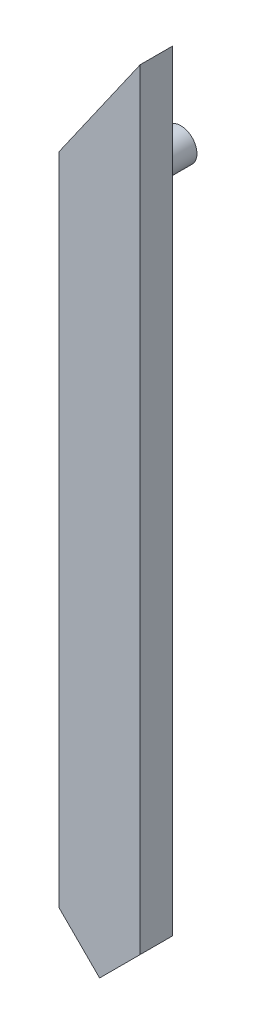
ISO-10303-21;
HEADER;
FILE_DESCRIPTION(('STEP AP214'),'2;1');
FILE_NAME('part.step','',(''),(''),'','','');
FILE_SCHEMA(('AUTOMOTIVE_DESIGN { 1 0 10303 214 1 1 1 1 }'));
ENDSEC;
DATA;
#1=APPLICATION_CONTEXT('core data for automotive mechanical design processes');
#2=APPLICATION_PROTOCOL_DEFINITION('international standard','automotive_design',2000,#1);
#3=PRODUCT_CONTEXT('',#1,'mechanical');
#4=PRODUCT('Part','Part','',(#3));
#5=PRODUCT_RELATED_PRODUCT_CATEGORY('part','',(#4));
#6=PRODUCT_DEFINITION_FORMATION('','',#4);
#7=PRODUCT_DEFINITION_CONTEXT('part definition',#1,'design');
#8=PRODUCT_DEFINITION('design','',#6,#7);
#9=PRODUCT_DEFINITION_SHAPE('','',#8);
#10=(LENGTH_UNIT() NAMED_UNIT(*) SI_UNIT(.MILLI.,.METRE.));
#11=(NAMED_UNIT(*) PLANE_ANGLE_UNIT() SI_UNIT($,.RADIAN.));
#12=(NAMED_UNIT(*) SI_UNIT($,.STERADIAN.) SOLID_ANGLE_UNIT());
#13=UNCERTAINTY_MEASURE_WITH_UNIT(LENGTH_MEASURE(1.E-05),#10,'distance_accuracy_value','');
#14=(GEOMETRIC_REPRESENTATION_CONTEXT(3) GLOBAL_UNCERTAINTY_ASSIGNED_CONTEXT((#13)) GLOBAL_UNIT_ASSIGNED_CONTEXT((#10,
#11,#12)) REPRESENTATION_CONTEXT('',''));
#15=CARTESIAN_POINT('',(0.,0.,0.));
#16=DIRECTION('',(0.,0.,1.));
#17=DIRECTION('',(1.,0.,0.));
#18=AXIS2_PLACEMENT_3D('',#15,#16,#17);
#19=CARTESIAN_POINT('',(4.99999999999999,50.,4.));
#20=DIRECTION('',(-1.,0.,0.));
#21=DIRECTION('',(0.,-1.,0.));
#22=AXIS2_PLACEMENT_3D('',#19,#20,#21);
#23=PLANE('',#22);
#24=DIRECTION('',(0.,1.,0.));
#25=VECTOR('',#24,1.);
#26=CARTESIAN_POINT('',(4.99999999999999,50.,4.));
#27=LINE('',#26,#25);
#28=CARTESIAN_POINT('',(5.00000000000001,-45.,4.));
#29=VERTEX_POINT('',#28);
#30=CARTESIAN_POINT('',(4.99999999999999,50.,4.));
#31=VERTEX_POINT('',#30);
#32=EDGE_CURVE('E117',#29,#31,#27,.T.);
#33=ORIENTED_EDGE('',*,*,#32,.F.);
#34=DIRECTION('',(0.,0.,-1.));
#35=VECTOR('',#34,1.);
#36=CARTESIAN_POINT('',(5.00000000000001,-45.,4.));
#37=LINE('',#36,#35);
#38=CARTESIAN_POINT('',(5.00000000000001,-45.,0.));
#39=VERTEX_POINT('',#38);
#40=EDGE_CURVE('E11',#29,#39,#37,.T.);
#41=ORIENTED_EDGE('',*,*,#40,.T.);
#42=DIRECTION('',(0.,1.,0.));
#43=VECTOR('',#42,1.);
#44=CARTESIAN_POINT('',(4.99999999999999,50.,0.));
#45=LINE('',#44,#43);
#46=CARTESIAN_POINT('',(4.99999999999999,50.,0.));
#47=VERTEX_POINT('',#46);
#48=EDGE_CURVE('E111',#39,#47,#45,.T.);
#49=ORIENTED_EDGE('',*,*,#48,.T.);
#50=DIRECTION('',(0.,0.,-1.));
#51=VECTOR('',#50,1.);
#52=CARTESIAN_POINT('',(4.99999999999999,50.,4.));
#53=LINE('',#52,#51);
#54=EDGE_CURVE('E95',#31,#47,#53,.T.);
#55=ORIENTED_EDGE('',*,*,#54,.F.);
#56=EDGE_LOOP('',(#33,#41,#49,#55));
#57=FACE_BOUND('',#56,.T.);
#58=ADVANCED_FACE('F41',(#57),#23,.F.);
#59=CARTESIAN_POINT('',(-5.00000000000001,50.,4.));
#60=DIRECTION('',(1.,0.,0.));
#61=DIRECTION('',(0.,1.,0.));
#62=AXIS2_PLACEMENT_3D('',#59,#60,#61);
#63=PLANE('',#62);
#64=DIRECTION('',(0.,-1.,0.));
#65=VECTOR('',#64,1.);
#66=CARTESIAN_POINT('',(-5.00000000000001,50.,0.));
#67=LINE('',#66,#65);
#68=CARTESIAN_POINT('',(-5.00000000000001,35.7185199325789,0.));
#69=VERTEX_POINT('',#68);
#70=CARTESIAN_POINT('',(-4.99999999999999,-45.,0.));
#71=VERTEX_POINT('',#70);
#72=EDGE_CURVE('E107',#69,#71,#67,.T.);
#73=ORIENTED_EDGE('',*,*,#72,.T.);
#74=DIRECTION('',(0.,0.,1.));
#75=VECTOR('',#74,1.);
#76=CARTESIAN_POINT('',(-4.99999999999999,-45.,4.));
#77=LINE('',#76,#75);
#78=CARTESIAN_POINT('',(-4.99999999999999,-45.,4.));
#79=VERTEX_POINT('',#78);
#80=EDGE_CURVE('E132',#71,#79,#77,.T.);
#81=ORIENTED_EDGE('',*,*,#80,.T.);
#82=DIRECTION('',(0.,-1.,0.));
#83=VECTOR('',#82,1.);
#84=CARTESIAN_POINT('',(-5.00000000000001,50.,4.));
#85=LINE('',#84,#83);
#86=CARTESIAN_POINT('',(-5.00000000000001,35.7185199325789,4.));
#87=VERTEX_POINT('',#86);
#88=EDGE_CURVE('E109',#87,#79,#85,.T.);
#89=ORIENTED_EDGE('',*,*,#88,.F.);
#90=DIRECTION('',(0.,0.,1.));
#91=VECTOR('',#90,1.);
#92=CARTESIAN_POINT('',(-5.00000000000001,35.7185199325789,0.));
#93=LINE('',#92,#91);
#94=EDGE_CURVE('E92',#69,#87,#93,.T.);
#95=ORIENTED_EDGE('',*,*,#94,.F.);
#96=EDGE_LOOP('',(#73,#81,#89,#95));
#97=FACE_BOUND('',#96,.T.);
#98=ADVANCED_FACE('F105',(#97),#63,.F.);
#99=CARTESIAN_POINT('',(0.,0.,4.));
#100=DIRECTION('',(0.,0.,1.));
#101=DIRECTION('',(1.,0.,0.));
#102=AXIS2_PLACEMENT_3D('',#99,#100,#101);
#103=PLANE('',#102);
#104=ORIENTED_EDGE('',*,*,#88,.T.);
#105=DIRECTION('',(-0.707106781186547,0.707106781186549,0.));
#106=VECTOR('',#105,1.);
#107=CARTESIAN_POINT('',(-25.,-24.9999999999999,4.));
#108=LINE('',#107,#106);
#109=CARTESIAN_POINT('',(0.,-50.,4.));
#110=VERTEX_POINT('',#109);
#111=EDGE_CURVE('E52',#79,#110,#108,.F.);
#112=ORIENTED_EDGE('',*,*,#111,.T.);
#113=DIRECTION('',(-0.70710678118655,-0.707106781186546,0.));
#114=VECTOR('',#113,1.);
#115=CARTESIAN_POINT('',(25.,-25.0000000000001,4.));
#116=LINE('',#115,#114);
#117=EDGE_CURVE('E60',#110,#29,#116,.F.);
#118=ORIENTED_EDGE('',*,*,#117,.T.);
#119=ORIENTED_EDGE('',*,*,#32,.T.);
#120=DIRECTION('',(0.573576436351047,0.819152044288991,0.));
#121=VECTOR('',#120,1.);
#122=CARTESIAN_POINT('',(4.99999999999999,50.,4.));
#123=LINE('',#122,#121);
#124=EDGE_CURVE('E100',#87,#31,#123,.T.);
#125=ORIENTED_EDGE('',*,*,#124,.F.);
#126=EDGE_LOOP('',(#104,#112,#118,#119,#125));
#127=FACE_BOUND('',#126,.T.);
#128=ADVANCED_FACE('F156',(#127),#103,.T.);
#129=CARTESIAN_POINT('',(0.,0.,0.));
#130=DIRECTION('',(0.,0.,1.));
#131=DIRECTION('',(1.,0.,0.));
#132=AXIS2_PLACEMENT_3D('',#129,#130,#131);
#133=PLANE('',#132);
#134=CARTESIAN_POINT('',(0.,34.,0.));
#135=DIRECTION('',(0.,0.,1.));
#136=DIRECTION('',(1.,0.,0.));
#137=AXIS2_PLACEMENT_3D('',#134,#135,#136);
#138=CIRCLE('',#137,2.);
#139=CARTESIAN_POINT('',(2.00000000000001,34.,0.));
#140=VERTEX_POINT('',#139);
#141=EDGE_CURVE('E46',#140,#140,#138,.T.);
#142=ORIENTED_EDGE('',*,*,#141,.T.);
#143=EDGE_LOOP('',(#142));
#144=FACE_BOUND('',#143,.T.);
#145=DIRECTION('',(0.70710678118655,0.707106781186546,0.));
#146=VECTOR('',#145,1.);
#147=CARTESIAN_POINT('',(5.00000000000001,-45.,0.));
#148=LINE('',#147,#146);
#149=CARTESIAN_POINT('',(0.,-50.,0.));
#150=VERTEX_POINT('',#149);
#151=EDGE_CURVE('E127',#39,#150,#148,.F.);
#152=ORIENTED_EDGE('',*,*,#151,.T.);
#153=DIRECTION('',(0.707106781186547,-0.707106781186549,0.));
#154=VECTOR('',#153,1.);
#155=CARTESIAN_POINT('',(0.,-50.,0.));
#156=LINE('',#155,#154);
#157=EDGE_CURVE('E115',#150,#71,#156,.F.);
#158=ORIENTED_EDGE('',*,*,#157,.T.);
#159=ORIENTED_EDGE('',*,*,#72,.F.);
#160=DIRECTION('',(0.573576436351047,0.819152044288991,0.));
#161=VECTOR('',#160,1.);
#162=CARTESIAN_POINT('',(4.99999999999999,50.,0.));
#163=LINE('',#162,#161);
#164=EDGE_CURVE('E88',#69,#47,#163,.T.);
#165=ORIENTED_EDGE('',*,*,#164,.T.);
#166=ORIENTED_EDGE('',*,*,#48,.F.);
#167=EDGE_LOOP('',(#152,#158,#159,#165,#166));
#168=FACE_BOUND('',#167,.T.);
#169=ADVANCED_FACE('F113',(#144,#168),#133,.F.);
#170=CARTESIAN_POINT('',(4.99999999999999,50.,0.));
#171=DIRECTION('',(0.819152044288991,-0.573576436351047,0.));
#172=DIRECTION('',(0.573576436351047,0.819152044288991,0.));
#173=AXIS2_PLACEMENT_3D('',#170,#171,#172);
#174=PLANE('',#173);
#175=ORIENTED_EDGE('',*,*,#124,.T.);
#176=ORIENTED_EDGE('',*,*,#54,.T.);
#177=ORIENTED_EDGE('',*,*,#164,.F.);
#178=ORIENTED_EDGE('',*,*,#94,.T.);
#179=EDGE_LOOP('',(#175,#176,#177,#178));
#180=FACE_BOUND('',#179,.T.);
#181=ADVANCED_FACE('F91',(#180),#174,.F.);
#182=CARTESIAN_POINT('',(5.00000000000001,-45.,4.));
#183=DIRECTION('',(-0.707106781186545,0.707106781186549,0.));
#184=DIRECTION('',(0.,0.,-1.));
#185=AXIS2_PLACEMENT_3D('',#182,#183,#184);
#186=PLANE('',#185);
#187=ORIENTED_EDGE('',*,*,#40,.F.);
#188=ORIENTED_EDGE('',*,*,#117,.F.);
#189=DIRECTION('',(0.,0.,1.));
#190=VECTOR('',#189,1.);
#191=CARTESIAN_POINT('',(0.,-50.,4.));
#192=LINE('',#191,#190);
#193=EDGE_CURVE('E138',#150,#110,#192,.T.);
#194=ORIENTED_EDGE('',*,*,#193,.F.);
#195=ORIENTED_EDGE('',*,*,#151,.F.);
#196=EDGE_LOOP('',(#187,#188,#194,#195));
#197=FACE_BOUND('',#196,.T.);
#198=ADVANCED_FACE('F44',(#197),#186,.F.);
#199=CARTESIAN_POINT('',(0.,-50.,4.));
#200=DIRECTION('',(0.707106781186549,0.707106781186547,0.));
#201=DIRECTION('',(0.,0.,-1.));
#202=AXIS2_PLACEMENT_3D('',#199,#200,#201);
#203=PLANE('',#202);
#204=ORIENTED_EDGE('',*,*,#111,.F.);
#205=ORIENTED_EDGE('',*,*,#80,.F.);
#206=ORIENTED_EDGE('',*,*,#157,.F.);
#207=ORIENTED_EDGE('',*,*,#193,.T.);
#208=EDGE_LOOP('',(#204,#205,#206,#207));
#209=FACE_BOUND('',#208,.T.);
#210=ADVANCED_FACE('F161',(#209),#203,.F.);
#211=CARTESIAN_POINT('',(0.,34.,-6.));
#212=DIRECTION('',(0.,0.,1.));
#213=DIRECTION('',(1.,0.,0.));
#214=AXIS2_PLACEMENT_3D('',#211,#212,#213);
#215=CYLINDRICAL_SURFACE('',#214,2.);
#216=CARTESIAN_POINT('',(0.,34.,-6.));
#217=DIRECTION('',(0.,0.,1.));
#218=DIRECTION('',(1.,0.,0.));
#219=AXIS2_PLACEMENT_3D('',#216,#217,#218);
#220=CIRCLE('',#219,2.);
#221=CARTESIAN_POINT('',(2.00000000000001,34.,-6.));
#222=VERTEX_POINT('',#221);
#223=EDGE_CURVE('E147',#222,#222,#220,.T.);
#224=ORIENTED_EDGE('',*,*,#223,.T.);
#225=EDGE_LOOP('',(#224));
#226=FACE_BOUND('',#225,.T.);
#227=ORIENTED_EDGE('',*,*,#141,.F.);
#228=EDGE_LOOP('',(#227));
#229=FACE_BOUND('',#228,.T.);
#230=ADVANCED_FACE('F163',(#226,#229),#215,.T.);
#231=CARTESIAN_POINT('',(0.,34.,-6.));
#232=DIRECTION('',(0.,0.,1.));
#233=DIRECTION('',(1.,0.,0.));
#234=AXIS2_PLACEMENT_3D('',#231,#232,#233);
#235=PLANE('',#234);
#236=ORIENTED_EDGE('',*,*,#223,.F.);
#237=EDGE_LOOP('',(#236));
#238=FACE_BOUND('',#237,.T.);
#239=ADVANCED_FACE('F168',(#238),#235,.F.);
#240=CLOSED_SHELL('',(#58,#98,#128,#169,#181,#198,#210,#230,#239));
#241=MANIFOLD_SOLID_BREP('B2',#240);
#242=ADVANCED_BREP_SHAPE_REPRESENTATION('',(#18,#241),#14);
#243=SHAPE_DEFINITION_REPRESENTATION(#9,#242);
ENDSEC;
END-ISO-10303-21;
